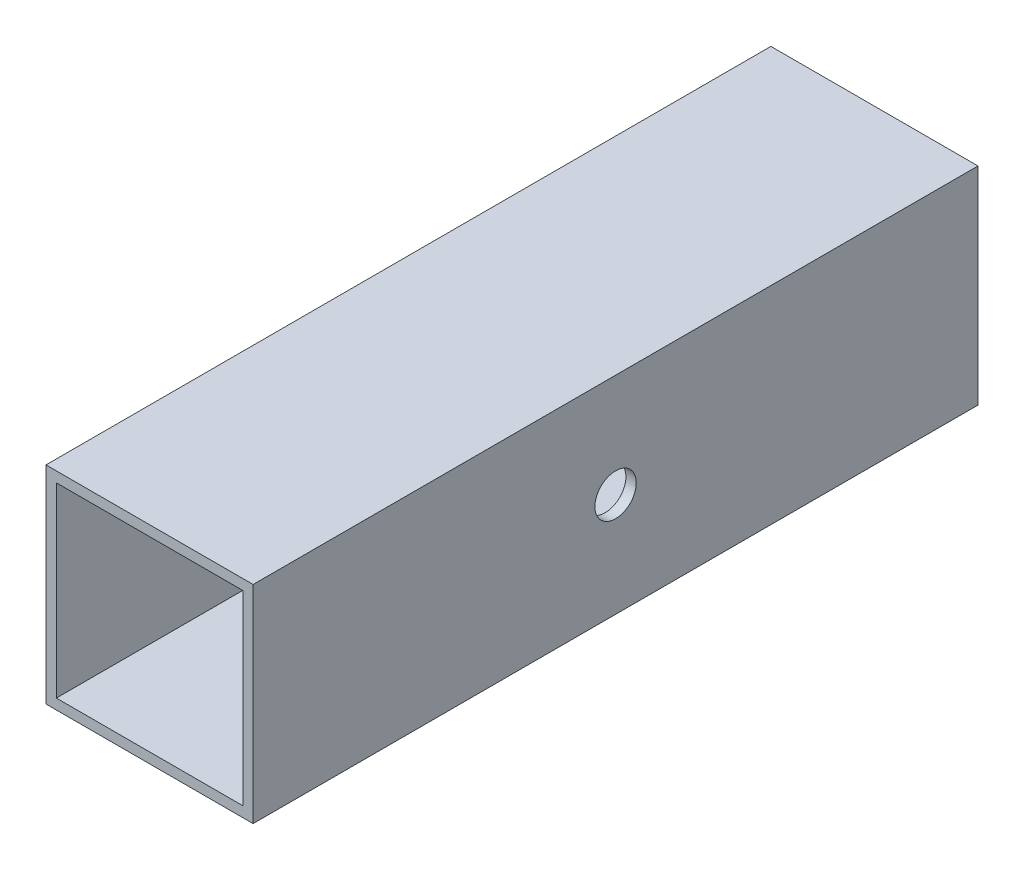
ISO-10303-21;
HEADER;
FILE_DESCRIPTION(('STEP AP214'),'2;1');
FILE_NAME('part.step','',(''),(''),'','','');
FILE_SCHEMA(('AUTOMOTIVE_DESIGN { 1 0 10303 214 1 1 1 1 }'));
ENDSEC;
DATA;
#1=APPLICATION_CONTEXT('core data for automotive mechanical design processes');
#2=APPLICATION_PROTOCOL_DEFINITION('international standard','automotive_design',2000,#1);
#3=PRODUCT_CONTEXT('',#1,'mechanical');
#4=PRODUCT('Part','Part','',(#3));
#5=PRODUCT_RELATED_PRODUCT_CATEGORY('part','',(#4));
#6=PRODUCT_DEFINITION_FORMATION('','',#4);
#7=PRODUCT_DEFINITION_CONTEXT('part definition',#1,'design');
#8=PRODUCT_DEFINITION('design','',#6,#7);
#9=PRODUCT_DEFINITION_SHAPE('','',#8);
#10=(LENGTH_UNIT() NAMED_UNIT(*) SI_UNIT(.MILLI.,.METRE.));
#11=(NAMED_UNIT(*) PLANE_ANGLE_UNIT() SI_UNIT($,.RADIAN.));
#12=(NAMED_UNIT(*) SI_UNIT($,.STERADIAN.) SOLID_ANGLE_UNIT());
#13=UNCERTAINTY_MEASURE_WITH_UNIT(LENGTH_MEASURE(1.E-05),#10,'distance_accuracy_value','');
#14=(GEOMETRIC_REPRESENTATION_CONTEXT(3) GLOBAL_UNCERTAINTY_ASSIGNED_CONTEXT((#13)) GLOBAL_UNIT_ASSIGNED_CONTEXT((#10,
#11,#12)) REPRESENTATION_CONTEXT('',''));
#15=CARTESIAN_POINT('',(0.,0.,0.));
#16=DIRECTION('',(0.,0.,1.));
#17=DIRECTION('',(1.,0.,0.));
#18=AXIS2_PLACEMENT_3D('',#15,#16,#17);
#19=CARTESIAN_POINT('',(0.,0.,70.));
#20=DIRECTION('',(0.,0.,1.));
#21=DIRECTION('',(1.,0.,0.));
#22=AXIS2_PLACEMENT_3D('',#19,#20,#21);
#23=PLANE('',#22);
#24=DIRECTION('',(0.,-1.,0.));
#25=VECTOR('',#24,1.);
#26=CARTESIAN_POINT('',(-10.,-10.,70.));
#27=LINE('',#26,#25);
#28=CARTESIAN_POINT('',(-10.,10.,70.));
#29=VERTEX_POINT('',#28);
#30=CARTESIAN_POINT('',(-10.,-10.,70.));
#31=VERTEX_POINT('',#30);
#32=EDGE_CURVE('E156',#29,#31,#27,.T.);
#33=ORIENTED_EDGE('',*,*,#32,.T.);
#34=DIRECTION('',(1.,0.,0.));
#35=VECTOR('',#34,1.);
#36=CARTESIAN_POINT('',(10.,-9.99999999999999,70.));
#37=LINE('',#36,#35);
#38=CARTESIAN_POINT('',(10.,-9.99999999999999,70.));
#39=VERTEX_POINT('',#38);
#40=EDGE_CURVE('E160',#31,#39,#37,.T.);
#41=ORIENTED_EDGE('',*,*,#40,.T.);
#42=DIRECTION('',(0.,1.,0.));
#43=VECTOR('',#42,1.);
#44=CARTESIAN_POINT('',(10.,-9.99999999999999,70.));
#45=LINE('',#44,#43);
#46=CARTESIAN_POINT('',(10.,10.,70.));
#47=VERTEX_POINT('',#46);
#48=EDGE_CURVE('E164',#39,#47,#45,.T.);
#49=ORIENTED_EDGE('',*,*,#48,.T.);
#50=DIRECTION('',(-1.,0.,0.));
#51=VECTOR('',#50,1.);
#52=CARTESIAN_POINT('',(10.,10.,70.));
#53=LINE('',#52,#51);
#54=EDGE_CURVE('E167',#47,#29,#53,.T.);
#55=ORIENTED_EDGE('',*,*,#54,.T.);
#56=EDGE_LOOP('',(#33,#41,#49,#55));
#57=FACE_BOUND('',#56,.T.);
#58=DIRECTION('',(-1.,0.,0.));
#59=VECTOR('',#58,1.);
#60=CARTESIAN_POINT('',(9.,9.00000000000001,70.));
#61=LINE('',#60,#59);
#62=CARTESIAN_POINT('',(9.,9.00000000000001,70.));
#63=VERTEX_POINT('',#62);
#64=CARTESIAN_POINT('',(-9.,9.,70.));
#65=VERTEX_POINT('',#64);
#66=EDGE_CURVE('E115',#63,#65,#61,.T.);
#67=ORIENTED_EDGE('',*,*,#66,.F.);
#68=DIRECTION('',(0.,1.,0.));
#69=VECTOR('',#68,1.);
#70=CARTESIAN_POINT('',(9.,-8.99999999999999,70.));
#71=LINE('',#70,#69);
#72=CARTESIAN_POINT('',(9.,-8.99999999999999,70.));
#73=VERTEX_POINT('',#72);
#74=EDGE_CURVE('E106',#73,#63,#71,.T.);
#75=ORIENTED_EDGE('',*,*,#74,.F.);
#76=DIRECTION('',(1.,0.,0.));
#77=VECTOR('',#76,1.);
#78=CARTESIAN_POINT('',(9.,-8.99999999999999,70.));
#79=LINE('',#78,#77);
#80=CARTESIAN_POINT('',(-9.,-9.,70.));
#81=VERTEX_POINT('',#80);
#82=EDGE_CURVE('E132',#81,#73,#79,.T.);
#83=ORIENTED_EDGE('',*,*,#82,.F.);
#84=DIRECTION('',(0.,-1.,0.));
#85=VECTOR('',#84,1.);
#86=CARTESIAN_POINT('',(-9.,-9.,70.));
#87=LINE('',#86,#85);
#88=EDGE_CURVE('E128',#65,#81,#87,.T.);
#89=ORIENTED_EDGE('',*,*,#88,.F.);
#90=EDGE_LOOP('',(#67,#75,#83,#89));
#91=FACE_BOUND('',#90,.T.);
#92=ADVANCED_FACE('F39',(#57,#91),#23,.T.);
#93=CARTESIAN_POINT('',(0.,0.,0.));
#94=DIRECTION('',(0.,0.,1.));
#95=DIRECTION('',(1.,0.,0.));
#96=AXIS2_PLACEMENT_3D('',#93,#94,#95);
#97=PLANE('',#96);
#98=DIRECTION('',(0.,-1.,0.));
#99=VECTOR('',#98,1.);
#100=CARTESIAN_POINT('',(-10.,-10.,0.));
#101=LINE('',#100,#99);
#102=CARTESIAN_POINT('',(-10.,10.,0.));
#103=VERTEX_POINT('',#102);
#104=CARTESIAN_POINT('',(-10.,-10.,0.));
#105=VERTEX_POINT('',#104);
#106=EDGE_CURVE('E124',#103,#105,#101,.T.);
#107=ORIENTED_EDGE('',*,*,#106,.F.);
#108=DIRECTION('',(-1.,0.,0.));
#109=VECTOR('',#108,1.);
#110=CARTESIAN_POINT('',(10.,10.,0.));
#111=LINE('',#110,#109);
#112=CARTESIAN_POINT('',(10.,10.,0.));
#113=VERTEX_POINT('',#112);
#114=EDGE_CURVE('E161',#113,#103,#111,.T.);
#115=ORIENTED_EDGE('',*,*,#114,.F.);
#116=DIRECTION('',(0.,1.,0.));
#117=VECTOR('',#116,1.);
#118=CARTESIAN_POINT('',(10.,-9.99999999999999,0.));
#119=LINE('',#118,#117);
#120=CARTESIAN_POINT('',(10.,-9.99999999999999,0.));
#121=VERTEX_POINT('',#120);
#122=EDGE_CURVE('E177',#121,#113,#119,.T.);
#123=ORIENTED_EDGE('',*,*,#122,.F.);
#124=DIRECTION('',(1.,0.,0.));
#125=VECTOR('',#124,1.);
#126=CARTESIAN_POINT('',(10.,-9.99999999999999,0.));
#127=LINE('',#126,#125);
#128=EDGE_CURVE('E174',#105,#121,#127,.T.);
#129=ORIENTED_EDGE('',*,*,#128,.F.);
#130=EDGE_LOOP('',(#107,#115,#123,#129));
#131=FACE_BOUND('',#130,.T.);
#132=DIRECTION('',(0.,1.,0.));
#133=VECTOR('',#132,1.);
#134=CARTESIAN_POINT('',(9.,-8.99999999999999,0.));
#135=LINE('',#134,#133);
#136=CARTESIAN_POINT('',(9.,-8.99999999999999,0.));
#137=VERTEX_POINT('',#136);
#138=CARTESIAN_POINT('',(9.,9.00000000000001,0.));
#139=VERTEX_POINT('',#138);
#140=EDGE_CURVE('E64',#137,#139,#135,.T.);
#141=ORIENTED_EDGE('',*,*,#140,.T.);
#142=DIRECTION('',(-1.,0.,0.));
#143=VECTOR('',#142,1.);
#144=CARTESIAN_POINT('',(9.,9.00000000000001,0.));
#145=LINE('',#144,#143);
#146=CARTESIAN_POINT('',(-9.,9.,0.));
#147=VERTEX_POINT('',#146);
#148=EDGE_CURVE('E122',#139,#147,#145,.T.);
#149=ORIENTED_EDGE('',*,*,#148,.T.);
#150=DIRECTION('',(0.,-1.,0.));
#151=VECTOR('',#150,1.);
#152=CARTESIAN_POINT('',(-9.,-9.,0.));
#153=LINE('',#152,#151);
#154=CARTESIAN_POINT('',(-9.,-9.,0.));
#155=VERTEX_POINT('',#154);
#156=EDGE_CURVE('E143',#147,#155,#153,.T.);
#157=ORIENTED_EDGE('',*,*,#156,.T.);
#158=DIRECTION('',(1.,0.,0.));
#159=VECTOR('',#158,1.);
#160=CARTESIAN_POINT('',(9.,-8.99999999999999,0.));
#161=LINE('',#160,#159);
#162=EDGE_CURVE('E116',#155,#137,#161,.T.);
#163=ORIENTED_EDGE('',*,*,#162,.T.);
#164=EDGE_LOOP('',(#141,#149,#157,#163));
#165=FACE_BOUND('',#164,.T.);
#166=ADVANCED_FACE('F201',(#131,#165),#97,.F.);
#167=CARTESIAN_POINT('',(-10.,-10.,70.));
#168=DIRECTION('',(1.,0.,0.));
#169=DIRECTION('',(0.,0.,-1.));
#170=AXIS2_PLACEMENT_3D('',#167,#168,#169);
#171=PLANE('',#170);
#172=CARTESIAN_POINT('',(-10.,0.,35.));
#173=DIRECTION('',(1.,0.,0.));
#174=DIRECTION('',(0.,0.,-1.));
#175=AXIS2_PLACEMENT_3D('',#172,#173,#174);
#176=CIRCLE('',#175,2.);
#177=CARTESIAN_POINT('',(-10.,0.,33.));
#178=VERTEX_POINT('',#177);
#179=EDGE_CURVE('E140',#178,#178,#176,.T.);
#180=ORIENTED_EDGE('',*,*,#179,.T.);
#181=EDGE_LOOP('',(#180));
#182=FACE_BOUND('',#181,.T.);
#183=ORIENTED_EDGE('',*,*,#106,.T.);
#184=DIRECTION('',(0.,0.,-1.));
#185=VECTOR('',#184,1.);
#186=CARTESIAN_POINT('',(-10.,-10.,70.));
#187=LINE('',#186,#185);
#188=EDGE_CURVE('E11',#31,#105,#187,.T.);
#189=ORIENTED_EDGE('',*,*,#188,.F.);
#190=ORIENTED_EDGE('',*,*,#32,.F.);
#191=DIRECTION('',(0.,0.,-1.));
#192=VECTOR('',#191,1.);
#193=CARTESIAN_POINT('',(-10.,10.,70.));
#194=LINE('',#193,#192);
#195=EDGE_CURVE('E170',#29,#103,#194,.T.);
#196=ORIENTED_EDGE('',*,*,#195,.T.);
#197=EDGE_LOOP('',(#183,#189,#190,#196));
#198=FACE_BOUND('',#197,.T.);
#199=ADVANCED_FACE('F41',(#182,#198),#171,.F.);
#200=CARTESIAN_POINT('',(10.,-9.99999999999999,70.));
#201=DIRECTION('',(0.,1.,0.));
#202=DIRECTION('',(-1.,0.,0.));
#203=AXIS2_PLACEMENT_3D('',#200,#201,#202);
#204=PLANE('',#203);
#205=ORIENTED_EDGE('',*,*,#128,.T.);
#206=DIRECTION('',(0.,0.,-1.));
#207=VECTOR('',#206,1.);
#208=CARTESIAN_POINT('',(10.,-9.99999999999999,70.));
#209=LINE('',#208,#207);
#210=EDGE_CURVE('E49',#39,#121,#209,.T.);
#211=ORIENTED_EDGE('',*,*,#210,.F.);
#212=ORIENTED_EDGE('',*,*,#40,.F.);
#213=ORIENTED_EDGE('',*,*,#188,.T.);
#214=EDGE_LOOP('',(#205,#211,#212,#213));
#215=FACE_BOUND('',#214,.T.);
#216=ADVANCED_FACE('F211',(#215),#204,.F.);
#217=CARTESIAN_POINT('',(10.,-9.99999999999999,70.));
#218=DIRECTION('',(-1.,0.,0.));
#219=DIRECTION('',(0.,0.,1.));
#220=AXIS2_PLACEMENT_3D('',#217,#218,#219);
#221=PLANE('',#220);
#222=CARTESIAN_POINT('',(10.,0.,35.));
#223=DIRECTION('',(1.,0.,0.));
#224=DIRECTION('',(0.,0.,-1.));
#225=AXIS2_PLACEMENT_3D('',#222,#223,#224);
#226=CIRCLE('',#225,2.);
#227=CARTESIAN_POINT('',(10.,0.,33.));
#228=VERTEX_POINT('',#227);
#229=EDGE_CURVE('E248',#228,#228,#226,.T.);
#230=ORIENTED_EDGE('',*,*,#229,.F.);
#231=EDGE_LOOP('',(#230));
#232=FACE_BOUND('',#231,.T.);
#233=ORIENTED_EDGE('',*,*,#122,.T.);
#234=DIRECTION('',(0.,0.,-1.));
#235=VECTOR('',#234,1.);
#236=CARTESIAN_POINT('',(10.,10.,70.));
#237=LINE('',#236,#235);
#238=EDGE_CURVE('E185',#47,#113,#237,.T.);
#239=ORIENTED_EDGE('',*,*,#238,.F.);
#240=ORIENTED_EDGE('',*,*,#48,.F.);
#241=ORIENTED_EDGE('',*,*,#210,.T.);
#242=EDGE_LOOP('',(#233,#239,#240,#241));
#243=FACE_BOUND('',#242,.T.);
#244=ADVANCED_FACE('F195',(#232,#243),#221,.F.);
#245=CARTESIAN_POINT('',(10.,10.,70.));
#246=DIRECTION('',(0.,-1.,0.));
#247=DIRECTION('',(1.,0.,0.));
#248=AXIS2_PLACEMENT_3D('',#245,#246,#247);
#249=PLANE('',#248);
#250=ORIENTED_EDGE('',*,*,#114,.T.);
#251=ORIENTED_EDGE('',*,*,#195,.F.);
#252=ORIENTED_EDGE('',*,*,#54,.F.);
#253=ORIENTED_EDGE('',*,*,#238,.T.);
#254=EDGE_LOOP('',(#250,#251,#252,#253));
#255=FACE_BOUND('',#254,.T.);
#256=ADVANCED_FACE('F205',(#255),#249,.F.);
#257=CARTESIAN_POINT('',(9.,-8.99999999999999,70.));
#258=DIRECTION('',(-1.,0.,0.));
#259=DIRECTION('',(0.,0.,1.));
#260=AXIS2_PLACEMENT_3D('',#257,#258,#259);
#261=PLANE('',#260);
#262=CARTESIAN_POINT('',(9.,0.,35.));
#263=DIRECTION('',(-1.,0.,0.));
#264=DIRECTION('',(0.,0.,1.));
#265=AXIS2_PLACEMENT_3D('',#262,#263,#264);
#266=CIRCLE('',#265,2.);
#267=CARTESIAN_POINT('',(9.,0.,37.));
#268=VERTEX_POINT('',#267);
#269=EDGE_CURVE('E240',#268,#268,#266,.T.);
#270=ORIENTED_EDGE('',*,*,#269,.F.);
#271=EDGE_LOOP('',(#270));
#272=FACE_BOUND('',#271,.T.);
#273=ORIENTED_EDGE('',*,*,#140,.F.);
#274=DIRECTION('',(0.,0.,-1.));
#275=VECTOR('',#274,1.);
#276=CARTESIAN_POINT('',(9.,-8.99999999999999,70.));
#277=LINE('',#276,#275);
#278=EDGE_CURVE('E110',#73,#137,#277,.T.);
#279=ORIENTED_EDGE('',*,*,#278,.F.);
#280=ORIENTED_EDGE('',*,*,#74,.T.);
#281=DIRECTION('',(0.,0.,-1.));
#282=VECTOR('',#281,1.);
#283=CARTESIAN_POINT('',(9.,9.00000000000001,70.));
#284=LINE('',#283,#282);
#285=EDGE_CURVE('E109',#63,#139,#284,.T.);
#286=ORIENTED_EDGE('',*,*,#285,.T.);
#287=EDGE_LOOP('',(#273,#279,#280,#286));
#288=FACE_BOUND('',#287,.T.);
#289=ADVANCED_FACE('F108',(#272,#288),#261,.T.);
#290=CARTESIAN_POINT('',(9.,9.00000000000001,70.));
#291=DIRECTION('',(0.,-1.,0.));
#292=DIRECTION('',(1.,0.,0.));
#293=AXIS2_PLACEMENT_3D('',#290,#291,#292);
#294=PLANE('',#293);
#295=ORIENTED_EDGE('',*,*,#148,.F.);
#296=ORIENTED_EDGE('',*,*,#285,.F.);
#297=ORIENTED_EDGE('',*,*,#66,.T.);
#298=DIRECTION('',(0.,0.,-1.));
#299=VECTOR('',#298,1.);
#300=CARTESIAN_POINT('',(-9.,9.,70.));
#301=LINE('',#300,#299);
#302=EDGE_CURVE('E125',#65,#147,#301,.T.);
#303=ORIENTED_EDGE('',*,*,#302,.T.);
#304=EDGE_LOOP('',(#295,#296,#297,#303));
#305=FACE_BOUND('',#304,.T.);
#306=ADVANCED_FACE('F119',(#305),#294,.T.);
#307=CARTESIAN_POINT('',(-9.,-9.,70.));
#308=DIRECTION('',(1.,0.,0.));
#309=DIRECTION('',(0.,0.,-1.));
#310=AXIS2_PLACEMENT_3D('',#307,#308,#309);
#311=PLANE('',#310);
#312=CARTESIAN_POINT('',(-9.,0.,35.));
#313=DIRECTION('',(1.,0.,0.));
#314=DIRECTION('',(0.,0.,-1.));
#315=AXIS2_PLACEMENT_3D('',#312,#313,#314);
#316=CIRCLE('',#315,2.);
#317=CARTESIAN_POINT('',(-9.,0.,33.));
#318=VERTEX_POINT('',#317);
#319=EDGE_CURVE('E43',#318,#318,#316,.T.);
#320=ORIENTED_EDGE('',*,*,#319,.F.);
#321=EDGE_LOOP('',(#320));
#322=FACE_BOUND('',#321,.T.);
#323=ORIENTED_EDGE('',*,*,#156,.F.);
#324=ORIENTED_EDGE('',*,*,#302,.F.);
#325=ORIENTED_EDGE('',*,*,#88,.T.);
#326=DIRECTION('',(0.,0.,-1.));
#327=VECTOR('',#326,1.);
#328=CARTESIAN_POINT('',(-9.,-9.,70.));
#329=LINE('',#328,#327);
#330=EDGE_CURVE('E56',#81,#155,#329,.T.);
#331=ORIENTED_EDGE('',*,*,#330,.T.);
#332=EDGE_LOOP('',(#323,#324,#325,#331));
#333=FACE_BOUND('',#332,.T.);
#334=ADVANCED_FACE('F237',(#322,#333),#311,.T.);
#335=CARTESIAN_POINT('',(9.,-8.99999999999999,70.));
#336=DIRECTION('',(0.,1.,0.));
#337=DIRECTION('',(-1.,0.,0.));
#338=AXIS2_PLACEMENT_3D('',#335,#336,#337);
#339=PLANE('',#338);
#340=ORIENTED_EDGE('',*,*,#162,.F.);
#341=ORIENTED_EDGE('',*,*,#330,.F.);
#342=ORIENTED_EDGE('',*,*,#82,.T.);
#343=ORIENTED_EDGE('',*,*,#278,.T.);
#344=EDGE_LOOP('',(#340,#341,#342,#343));
#345=FACE_BOUND('',#344,.T.);
#346=ADVANCED_FACE('F261',(#345),#339,.T.);
#347=CARTESIAN_POINT('',(-30.,0.,35.));
#348=DIRECTION('',(1.,0.,0.));
#349=DIRECTION('',(0.,0.,-1.));
#350=AXIS2_PLACEMENT_3D('',#347,#348,#349);
#351=CYLINDRICAL_SURFACE('',#350,2.);
#352=ORIENTED_EDGE('',*,*,#319,.T.);
#353=EDGE_LOOP('',(#352));
#354=FACE_BOUND('',#353,.T.);
#355=ORIENTED_EDGE('',*,*,#179,.F.);
#356=EDGE_LOOP('',(#355));
#357=FACE_BOUND('',#356,.T.);
#358=ADVANCED_FACE('F256',(#354,#357),#351,.F.);
#359=ORIENTED_EDGE('',*,*,#269,.T.);
#360=EDGE_LOOP('',(#359));
#361=FACE_BOUND('',#360,.T.);
#362=ORIENTED_EDGE('',*,*,#229,.T.);
#363=EDGE_LOOP('',(#362));
#364=FACE_BOUND('',#363,.T.);
#365=ADVANCED_FACE('F254',(#361,#364),#351,.F.);
#366=CLOSED_SHELL('',(#92,#166,#199,#216,#244,#256,#289,#306,#334,#346,#358,#365));
#367=MANIFOLD_SOLID_BREP('B2',#366);
#368=ADVANCED_BREP_SHAPE_REPRESENTATION('',(#18,#367),#14);
#369=SHAPE_DEFINITION_REPRESENTATION(#9,#368);
ENDSEC;
END-ISO-10303-21;
